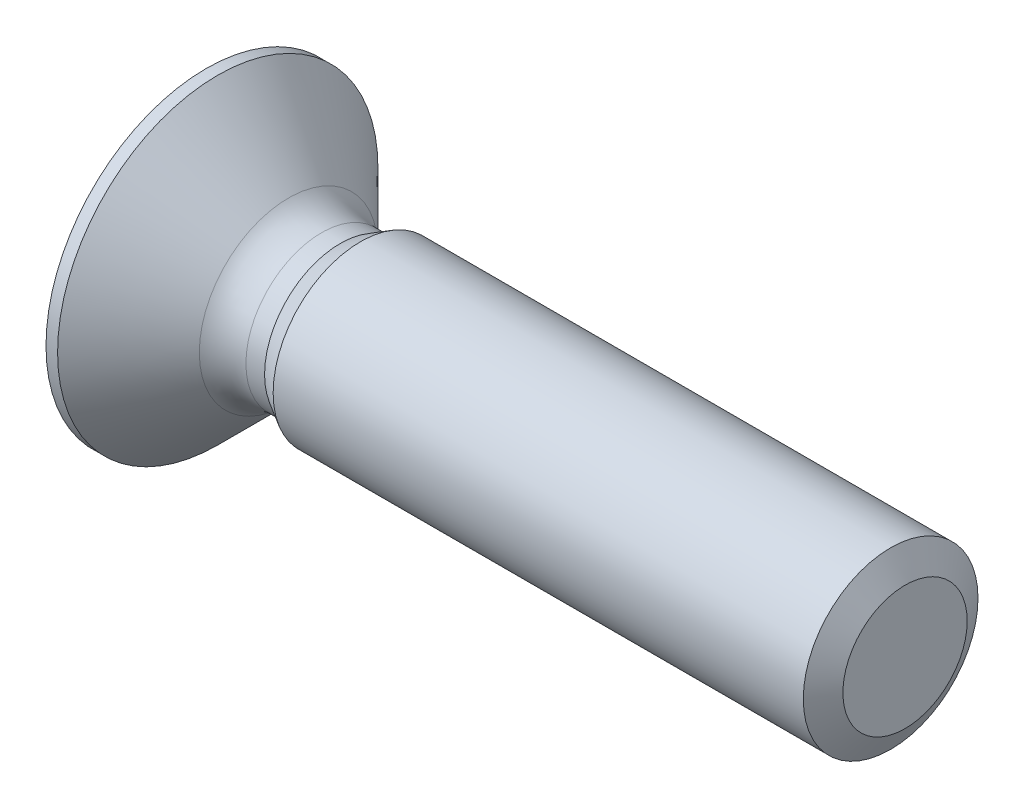
ISO-10303-21;
HEADER;
FILE_DESCRIPTION(('STEP AP214'),'2;1');
FILE_NAME('part.step','',(''),(''),'','','');
FILE_SCHEMA(('AUTOMOTIVE_DESIGN { 1 0 10303 214 1 1 1 1 }'));
ENDSEC;
DATA;
#1=APPLICATION_CONTEXT('core data for automotive mechanical design processes');
#2=APPLICATION_PROTOCOL_DEFINITION('international standard','automotive_design',2000,#1);
#3=PRODUCT_CONTEXT('',#1,'mechanical');
#4=PRODUCT('Part','Part','',(#3));
#5=PRODUCT_RELATED_PRODUCT_CATEGORY('part','',(#4));
#6=PRODUCT_DEFINITION_FORMATION('','',#4);
#7=PRODUCT_DEFINITION_CONTEXT('part definition',#1,'design');
#8=PRODUCT_DEFINITION('design','',#6,#7);
#9=PRODUCT_DEFINITION_SHAPE('','',#8);
#10=(LENGTH_UNIT() NAMED_UNIT(*) SI_UNIT(.MILLI.,.METRE.));
#11=(NAMED_UNIT(*) PLANE_ANGLE_UNIT() SI_UNIT($,.RADIAN.));
#12=(NAMED_UNIT(*) SI_UNIT($,.STERADIAN.) SOLID_ANGLE_UNIT());
#13=UNCERTAINTY_MEASURE_WITH_UNIT(LENGTH_MEASURE(1.E-05),#10,'distance_accuracy_value','');
#14=(GEOMETRIC_REPRESENTATION_CONTEXT(3) GLOBAL_UNCERTAINTY_ASSIGNED_CONTEXT((#13)) GLOBAL_UNIT_ASSIGNED_CONTEXT((#10,
#11,#12)) REPRESENTATION_CONTEXT('',''));
#15=CARTESIAN_POINT('',(0.,0.,0.));
#16=DIRECTION('',(0.,0.,1.));
#17=DIRECTION('',(1.,0.,0.));
#18=AXIS2_PLACEMENT_3D('',#15,#16,#17);
#19=CARTESIAN_POINT('',(0.,0.,0.));
#20=DIRECTION('',(1.,0.,0.));
#21=DIRECTION('',(0.,0.,-1.));
#22=AXIS2_PLACEMENT_3D('',#19,#20,#21);
#23=PLANE('',#22);
#24=CARTESIAN_POINT('',(0.,0.,0.));
#25=DIRECTION('',(-1.,0.,0.));
#26=DIRECTION('',(0.,0.,1.));
#27=AXIS2_PLACEMENT_3D('',#24,#25,#26);
#28=CIRCLE('',#27,2.75);
#29=CARTESIAN_POINT('',(0.,0.,2.75));
#30=VERTEX_POINT('',#29);
#31=EDGE_CURVE('E182',#30,#30,#28,.T.);
#32=ORIENTED_EDGE('',*,*,#31,.T.);
#33=EDGE_LOOP('',(#32));
#34=FACE_BOUND('',#33,.T.);
#35=DIRECTION('',(0.,1.,0.));
#36=VECTOR('',#35,1.);
#37=CARTESIAN_POINT('',(0.,1.6,0.250000000000006));
#38=LINE('',#37,#36);
#39=CARTESIAN_POINT('',(0.,0.25,0.250000000000001));
#40=VERTEX_POINT('',#39);
#41=CARTESIAN_POINT('',(0.,1.6,0.250000000000006));
#42=VERTEX_POINT('',#41);
#43=EDGE_CURVE('E104',#40,#42,#38,.T.);
#44=ORIENTED_EDGE('',*,*,#43,.F.);
#45=DIRECTION('',(0.,0.,-1.));
#46=VECTOR('',#45,1.);
#47=CARTESIAN_POINT('',(0.,0.25,-1.6));
#48=LINE('',#47,#46);
#49=CARTESIAN_POINT('',(0.,0.25,1.6));
#50=VERTEX_POINT('',#49);
#51=EDGE_CURVE('E149',#50,#40,#48,.T.);
#52=ORIENTED_EDGE('',*,*,#51,.F.);
#53=DIRECTION('',(0.,1.,0.));
#54=VECTOR('',#53,1.);
#55=CARTESIAN_POINT('',(0.,0.25,1.6));
#56=LINE('',#55,#54);
#57=CARTESIAN_POINT('',(0.,-0.25,1.6));
#58=VERTEX_POINT('',#57);
#59=EDGE_CURVE('E146',#58,#50,#56,.T.);
#60=ORIENTED_EDGE('',*,*,#59,.F.);
#61=DIRECTION('',(0.,0.,1.));
#62=VECTOR('',#61,1.);
#63=CARTESIAN_POINT('',(0.,-0.25,-1.6));
#64=LINE('',#63,#62);
#65=CARTESIAN_POINT('',(0.,-0.25,0.249999999999999));
#66=VERTEX_POINT('',#65);
#67=EDGE_CURVE('E77',#66,#58,#64,.T.);
#68=ORIENTED_EDGE('',*,*,#67,.F.);
#69=CARTESIAN_POINT('',(0.,-1.6,0.249999999999994));
#70=VERTEX_POINT('',#69);
#71=EDGE_CURVE('E112',#70,#66,#38,.T.);
#72=ORIENTED_EDGE('',*,*,#71,.F.);
#73=DIRECTION('',(0.,0.,1.));
#74=VECTOR('',#73,1.);
#75=CARTESIAN_POINT('',(0.,-1.6,0.249999999999994));
#76=LINE('',#75,#74);
#77=CARTESIAN_POINT('',(0.,-1.6,-0.250000000000006));
#78=VERTEX_POINT('',#77);
#79=EDGE_CURVE('E113',#78,#70,#76,.T.);
#80=ORIENTED_EDGE('',*,*,#79,.F.);
#81=DIRECTION('',(0.,-1.,0.));
#82=VECTOR('',#81,1.);
#83=CARTESIAN_POINT('',(0.,1.6,-0.249999999999994));
#84=LINE('',#83,#82);
#85=CARTESIAN_POINT('',(0.,-0.25,-0.250000000000001));
#86=VERTEX_POINT('',#85);
#87=EDGE_CURVE('E126',#86,#78,#84,.T.);
#88=ORIENTED_EDGE('',*,*,#87,.F.);
#89=CARTESIAN_POINT('',(0.,-0.25,-1.6));
#90=VERTEX_POINT('',#89);
#91=EDGE_CURVE('E143',#90,#86,#64,.T.);
#92=ORIENTED_EDGE('',*,*,#91,.F.);
#93=DIRECTION('',(0.,-1.,0.));
#94=VECTOR('',#93,1.);
#95=CARTESIAN_POINT('',(0.,0.25,-1.6));
#96=LINE('',#95,#94);
#97=CARTESIAN_POINT('',(0.,0.25,-1.6));
#98=VERTEX_POINT('',#97);
#99=EDGE_CURVE('E54',#98,#90,#96,.T.);
#100=ORIENTED_EDGE('',*,*,#99,.F.);
#101=CARTESIAN_POINT('',(0.,0.25,-0.249999999999999));
#102=VERTEX_POINT('',#101);
#103=EDGE_CURVE('E152',#102,#98,#48,.T.);
#104=ORIENTED_EDGE('',*,*,#103,.F.);
#105=CARTESIAN_POINT('',(0.,1.6,-0.249999999999994));
#106=VERTEX_POINT('',#105);
#107=EDGE_CURVE('E125',#106,#102,#84,.T.);
#108=ORIENTED_EDGE('',*,*,#107,.F.);
#109=DIRECTION('',(0.,0.,-1.));
#110=VECTOR('',#109,1.);
#111=CARTESIAN_POINT('',(0.,1.6,0.250000000000006));
#112=LINE('',#111,#110);
#113=EDGE_CURVE('E118',#42,#106,#112,.T.);
#114=ORIENTED_EDGE('',*,*,#113,.F.);
#115=EDGE_LOOP('',(#44,#52,#60,#68,#72,#80,#88,#92,#100,#104,#108,#114));
#116=FACE_BOUND('',#115,.T.);
#117=ADVANCED_FACE('F40',(#34,#116),#23,.F.);
#118=CARTESIAN_POINT('',(2.1,0.,0.));
#119=DIRECTION('',(-0.118212889785112,-0.992988274194944,0.));
#120=DIRECTION('',(0.992988274194944,-0.118212889785112,0.));
#121=AXIS2_PLACEMENT_3D('',#118,#119,#120);
#122=PLANE('',#121);
#123=ORIENTED_EDGE('',*,*,#51,.T.);
#124=DIRECTION('',(0.986122002690152,-0.117395476510732,-0.117395476510733));
#125=VECTOR('',#124,1.);
#126=CARTESIAN_POINT('',(2.1,0.,0.));
#127=LINE('',#126,#125);
#128=CARTESIAN_POINT('',(2.1,0.,0.));
#129=VERTEX_POINT('',#128);
#130=EDGE_CURVE('E83',#40,#129,#127,.T.);
#131=ORIENTED_EDGE('',*,*,#130,.T.);
#132=DIRECTION('',(0.791889207905293,-0.0942725247506301,-0.603344158404032));
#133=VECTOR('',#132,1.);
#134=CARTESIAN_POINT('',(0.,0.25,1.6));
#135=LINE('',#134,#133);
#136=EDGE_CURVE('E63',#50,#129,#135,.T.);
#137=ORIENTED_EDGE('',*,*,#136,.F.);
#138=EDGE_LOOP('',(#123,#131,#137));
#139=FACE_BOUND('',#138,.T.);
#140=ADVANCED_FACE('F198',(#139),#122,.T.);
#141=DIRECTION('',(0.791889207905293,-0.0942725247506301,0.603344158404032));
#142=VECTOR('',#141,1.);
#143=CARTESIAN_POINT('',(0.,0.25,-1.6));
#144=LINE('',#143,#142);
#145=EDGE_CURVE('E148',#98,#129,#144,.T.);
#146=ORIENTED_EDGE('',*,*,#145,.T.);
#147=DIRECTION('',(-0.986122002690152,0.117395476510732,-0.117395476510732));
#148=VECTOR('',#147,1.);
#149=CARTESIAN_POINT('',(2.1,0.,0.));
#150=LINE('',#149,#148);
#151=EDGE_CURVE('E130',#129,#102,#150,.T.);
#152=ORIENTED_EDGE('',*,*,#151,.T.);
#153=ORIENTED_EDGE('',*,*,#103,.T.);
#154=EDGE_LOOP('',(#146,#152,#153));
#155=FACE_BOUND('',#154,.T.);
#156=ADVANCED_FACE('F192',(#155),#122,.T.);
#157=CARTESIAN_POINT('',(2.1,0.,0.));
#158=DIRECTION('',(-0.118212889785112,0.992988274194944,0.));
#159=DIRECTION('',(-0.992988274194944,-0.118212889785112,0.));
#160=AXIS2_PLACEMENT_3D('',#157,#158,#159);
#161=PLANE('',#160);
#162=DIRECTION('',(0.791889207905293,0.0942725247506301,-0.603344158404032));
#163=VECTOR('',#162,1.);
#164=CARTESIAN_POINT('',(0.,-0.25,1.6));
#165=LINE('',#164,#163);
#166=EDGE_CURVE('E142',#58,#129,#165,.T.);
#167=ORIENTED_EDGE('',*,*,#166,.T.);
#168=DIRECTION('',(-0.986122002690152,-0.117395476510732,0.117395476510732));
#169=VECTOR('',#168,1.);
#170=CARTESIAN_POINT('',(2.1,0.,0.));
#171=LINE('',#170,#169);
#172=EDGE_CURVE('E11',#129,#66,#171,.T.);
#173=ORIENTED_EDGE('',*,*,#172,.T.);
#174=ORIENTED_EDGE('',*,*,#67,.T.);
#175=EDGE_LOOP('',(#167,#173,#174));
#176=FACE_BOUND('',#175,.T.);
#177=ADVANCED_FACE('F193',(#176),#161,.T.);
#178=ORIENTED_EDGE('',*,*,#91,.T.);
#179=DIRECTION('',(0.986122002690152,0.117395476510732,0.117395476510733));
#180=VECTOR('',#179,1.);
#181=CARTESIAN_POINT('',(2.1,0.,0.));
#182=LINE('',#181,#180);
#183=EDGE_CURVE('E47',#86,#129,#182,.T.);
#184=ORIENTED_EDGE('',*,*,#183,.T.);
#185=DIRECTION('',(0.791889207905293,0.0942725247506301,0.603344158404032));
#186=VECTOR('',#185,1.);
#187=CARTESIAN_POINT('',(0.,-0.25,-1.6));
#188=LINE('',#187,#186);
#189=EDGE_CURVE('E157',#90,#129,#188,.T.);
#190=ORIENTED_EDGE('',*,*,#189,.F.);
#191=EDGE_LOOP('',(#178,#184,#190));
#192=FACE_BOUND('',#191,.T.);
#193=ADVANCED_FACE('F186',(#192),#161,.T.);
#194=CARTESIAN_POINT('',(0.,0.,0.));
#195=DIRECTION('',(-1.,0.,0.));
#196=DIRECTION('',(0.,0.,1.));
#197=AXIS2_PLACEMENT_3D('',#194,#195,#196);
#198=CYLINDRICAL_SURFACE('',#197,2.75);
#199=ORIENTED_EDGE('',*,*,#31,.F.);
#200=EDGE_LOOP('',(#199));
#201=FACE_BOUND('',#200,.T.);
#202=CARTESIAN_POINT('',(0.199000000000005,0.,0.));
#203=DIRECTION('',(-1.,0.,0.));
#204=DIRECTION('',(0.,0.,1.));
#205=AXIS2_PLACEMENT_3D('',#202,#203,#204);
#206=CIRCLE('',#205,2.75);
#207=CARTESIAN_POINT('',(0.199000000000005,0.,2.75));
#208=VERTEX_POINT('',#207);
#209=EDGE_CURVE('E178',#208,#208,#206,.T.);
#210=ORIENTED_EDGE('',*,*,#209,.T.);
#211=EDGE_LOOP('',(#210));
#212=FACE_BOUND('',#211,.T.);
#213=ADVANCED_FACE('F226',(#201,#212),#198,.T.);
#214=CARTESIAN_POINT('',(1.41568542494924,0.,0.));
#215=DIRECTION('',(-1.,0.,0.));
#216=DIRECTION('',(0.,0.,1.));
#217=AXIS2_PLACEMENT_3D('',#214,#215,#216);
#218=CONICAL_SURFACE('',#217,1.53331457505076,0.78539816339745);
#219=ORIENTED_EDGE('',*,*,#209,.F.);
#220=EDGE_LOOP('',(#219));
#221=FACE_BOUND('',#220,.T.);
#222=CARTESIAN_POINT('',(1.41568542494924,0.,0.));
#223=DIRECTION('',(-1.,0.,0.));
#224=DIRECTION('',(0.,0.,1.));
#225=AXIS2_PLACEMENT_3D('',#222,#223,#224);
#226=CIRCLE('',#225,1.53331457505076);
#227=CARTESIAN_POINT('',(1.41568542494924,0.,1.53331457505076));
#228=VERTEX_POINT('',#227);
#229=EDGE_CURVE('E174',#228,#228,#226,.T.);
#230=ORIENTED_EDGE('',*,*,#229,.T.);
#231=EDGE_LOOP('',(#230));
#232=FACE_BOUND('',#231,.T.);
#233=ADVANCED_FACE('F229',(#221,#232),#218,.T.);
#234=CARTESIAN_POINT('',(1.98137084989848,0.,0.));
#235=DIRECTION('',(-1.,0.,0.));
#236=DIRECTION('',(0.,0.,1.));
#237=AXIS2_PLACEMENT_3D('',#234,#235,#236);
#238=TOROIDAL_SURFACE('',#237,2.099,0.8);
#239=ORIENTED_EDGE('',*,*,#229,.F.);
#240=EDGE_LOOP('',(#239));
#241=FACE_BOUND('',#240,.T.);
#242=CARTESIAN_POINT('',(1.98137084989848,0.,0.));
#243=DIRECTION('',(-1.,0.,0.));
#244=DIRECTION('',(0.,0.,1.));
#245=AXIS2_PLACEMENT_3D('',#242,#243,#244);
#246=CIRCLE('',#245,1.299);
#247=CARTESIAN_POINT('',(1.98137084989848,0.,1.299));
#248=VERTEX_POINT('',#247);
#249=EDGE_CURVE('E171',#248,#248,#246,.T.);
#250=ORIENTED_EDGE('',*,*,#249,.T.);
#251=EDGE_LOOP('',(#250));
#252=FACE_BOUND('',#251,.T.);
#253=ADVANCED_FACE('F234',(#241,#252),#238,.F.);
#254=CARTESIAN_POINT('',(0.,0.,0.));
#255=DIRECTION('',(-1.,0.,0.));
#256=DIRECTION('',(0.,0.,1.));
#257=AXIS2_PLACEMENT_3D('',#254,#255,#256);
#258=CYLINDRICAL_SURFACE('',#257,1.299);
#259=ORIENTED_EDGE('',*,*,#249,.F.);
#260=EDGE_LOOP('',(#259));
#261=FACE_BOUND('',#260,.T.);
#262=CARTESIAN_POINT('',(2.30185778767866,0.,0.));
#263=DIRECTION('',(-1.,0.,0.));
#264=DIRECTION('',(0.,0.,1.));
#265=AXIS2_PLACEMENT_3D('',#262,#263,#264);
#266=CIRCLE('',#265,1.299);
#267=CARTESIAN_POINT('',(2.30185778767866,0.,1.299));
#268=VERTEX_POINT('',#267);
#269=EDGE_CURVE('E168',#268,#268,#266,.T.);
#270=ORIENTED_EDGE('',*,*,#269,.T.);
#271=EDGE_LOOP('',(#270));
#272=FACE_BOUND('',#271,.T.);
#273=ADVANCED_FACE('F240',(#261,#272),#258,.T.);
#274=CARTESIAN_POINT('',(2.65,0.,0.));
#275=DIRECTION('',(1.,0.,0.));
#276=DIRECTION('',(0.,0.,-1.));
#277=AXIS2_PLACEMENT_3D('',#274,#275,#276);
#278=CONICAL_SURFACE('',#277,1.5,0.5235987755983);
#279=ORIENTED_EDGE('',*,*,#269,.F.);
#280=EDGE_LOOP('',(#279));
#281=FACE_BOUND('',#280,.T.);
#282=CARTESIAN_POINT('',(2.65,0.,0.));
#283=DIRECTION('',(-1.,0.,0.));
#284=DIRECTION('',(0.,0.,1.));
#285=AXIS2_PLACEMENT_3D('',#282,#283,#284);
#286=CIRCLE('',#285,1.5);
#287=CARTESIAN_POINT('',(2.65,0.,1.5));
#288=VERTEX_POINT('',#287);
#289=EDGE_CURVE('E165',#288,#288,#286,.T.);
#290=ORIENTED_EDGE('',*,*,#289,.T.);
#291=EDGE_LOOP('',(#290));
#292=FACE_BOUND('',#291,.T.);
#293=ADVANCED_FACE('F246',(#281,#292),#278,.T.);
#294=CARTESIAN_POINT('',(0.,0.,0.));
#295=DIRECTION('',(-1.,0.,0.));
#296=DIRECTION('',(0.,0.,1.));
#297=AXIS2_PLACEMENT_3D('',#294,#295,#296);
#298=CYLINDRICAL_SURFACE('',#297,1.5);
#299=CARTESIAN_POINT('',(11.7527080028712,0.,0.));
#300=DIRECTION('',(1.,0.,0.));
#301=DIRECTION('',(0.,0.,-1.));
#302=AXIS2_PLACEMENT_3D('',#299,#300,#301);
#303=CIRCLE('',#302,1.5);
#304=CARTESIAN_POINT('',(11.7527080028712,0.,-1.5));
#305=VERTEX_POINT('',#304);
#306=EDGE_CURVE('E162',#305,#305,#303,.T.);
#307=ORIENTED_EDGE('',*,*,#306,.F.);
#308=EDGE_LOOP('',(#307));
#309=FACE_BOUND('',#308,.T.);
#310=ORIENTED_EDGE('',*,*,#289,.F.);
#311=EDGE_LOOP('',(#310));
#312=FACE_BOUND('',#311,.T.);
#313=ADVANCED_FACE('F252',(#309,#312),#298,.T.);
#314=CARTESIAN_POINT('',(11.7527080028712,0.,0.));
#315=DIRECTION('',(-1.,0.,0.));
#316=DIRECTION('',(0.,0.,1.));
#317=AXIS2_PLACEMENT_3D('',#314,#315,#316);
#318=CONICAL_SURFACE('',#317,1.5,1.05188801855135);
#319=CARTESIAN_POINT('',(12.,0.,0.));
#320=DIRECTION('',(1.,0.,0.));
#321=DIRECTION('',(0.,0.,-1.));
#322=AXIS2_PLACEMENT_3D('',#319,#320,#321);
#323=CIRCLE('',#322,1.067);
#324=CARTESIAN_POINT('',(12.,0.,-1.067));
#325=VERTEX_POINT('',#324);
#326=EDGE_CURVE('E151',#325,#325,#323,.T.);
#327=ORIENTED_EDGE('',*,*,#326,.F.);
#328=EDGE_LOOP('',(#327));
#329=FACE_BOUND('',#328,.T.);
#330=ORIENTED_EDGE('',*,*,#306,.T.);
#331=EDGE_LOOP('',(#330));
#332=FACE_BOUND('',#331,.T.);
#333=ADVANCED_FACE('F257',(#329,#332),#318,.T.);
#334=CARTESIAN_POINT('',(12.,1.5,0.));
#335=DIRECTION('',(-1.,0.,0.));
#336=DIRECTION('',(0.,0.,1.));
#337=AXIS2_PLACEMENT_3D('',#334,#335,#336);
#338=PLANE('',#337);
#339=ORIENTED_EDGE('',*,*,#326,.T.);
#340=EDGE_LOOP('',(#339));
#341=FACE_BOUND('',#340,.T.);
#342=ADVANCED_FACE('F263',(#341),#338,.F.);
#343=CARTESIAN_POINT('',(0.,0.25,-1.6));
#344=DIRECTION('',(0.606043215262856,0.,-0.795431720032499));
#345=DIRECTION('',(-0.795431720032499,0.,-0.606043215262856));
#346=AXIS2_PLACEMENT_3D('',#343,#344,#345);
#347=PLANE('',#346);
#348=ORIENTED_EDGE('',*,*,#145,.F.);
#349=ORIENTED_EDGE('',*,*,#99,.T.);
#350=ORIENTED_EDGE('',*,*,#189,.T.);
#351=EDGE_LOOP('',(#348,#349,#350));
#352=FACE_BOUND('',#351,.T.);
#353=ADVANCED_FACE('F190',(#352),#347,.F.);
#354=CARTESIAN_POINT('',(0.,-0.25,1.6));
#355=DIRECTION('',(0.606043215262856,0.,0.795431720032499));
#356=DIRECTION('',(0.795431720032499,0.,-0.606043215262856));
#357=AXIS2_PLACEMENT_3D('',#354,#355,#356);
#358=PLANE('',#357);
#359=ORIENTED_EDGE('',*,*,#166,.F.);
#360=ORIENTED_EDGE('',*,*,#59,.T.);
#361=ORIENTED_EDGE('',*,*,#136,.T.);
#362=EDGE_LOOP('',(#359,#360,#361));
#363=FACE_BOUND('',#362,.T.);
#364=ADVANCED_FACE('F197',(#363),#358,.F.);
#365=CARTESIAN_POINT('',(2.1,0.,0.));
#366=DIRECTION('',(-0.118212889785112,0.,-0.992988274194944));
#367=DIRECTION('',(0.992988274194944,0.,-0.118212889785112));
#368=AXIS2_PLACEMENT_3D('',#365,#366,#367);
#369=PLANE('',#368);
#370=DIRECTION('',(0.791889207905293,0.603344158404033,-0.0942725247506279));
#371=VECTOR('',#370,1.);
#372=CARTESIAN_POINT('',(0.,-1.6,0.249999999999994));
#373=LINE('',#372,#371);
#374=EDGE_CURVE('E122',#70,#129,#373,.T.);
#375=ORIENTED_EDGE('',*,*,#374,.F.);
#376=ORIENTED_EDGE('',*,*,#71,.T.);
#377=ORIENTED_EDGE('',*,*,#172,.F.);
#378=EDGE_LOOP('',(#375,#376,#377));
#379=FACE_BOUND('',#378,.T.);
#380=ADVANCED_FACE('F202',(#379),#369,.T.);
#381=CARTESIAN_POINT('',(2.1,0.,0.));
#382=DIRECTION('',(-0.118212889785112,0.,0.992988274194944));
#383=DIRECTION('',(-0.992988274194944,0.,-0.118212889785112));
#384=AXIS2_PLACEMENT_3D('',#381,#382,#383);
#385=PLANE('',#384);
#386=ORIENTED_EDGE('',*,*,#87,.T.);
#387=DIRECTION('',(0.791889207905293,0.603344158404032,0.0942725247506322));
#388=VECTOR('',#387,1.);
#389=CARTESIAN_POINT('',(0.,-1.6,-0.250000000000006));
#390=LINE('',#389,#388);
#391=EDGE_CURVE('E136',#78,#129,#390,.T.);
#392=ORIENTED_EDGE('',*,*,#391,.T.);
#393=ORIENTED_EDGE('',*,*,#183,.F.);
#394=EDGE_LOOP('',(#386,#392,#393));
#395=FACE_BOUND('',#394,.T.);
#396=ADVANCED_FACE('F206',(#395),#385,.T.);
#397=CARTESIAN_POINT('',(0.,-1.6,-0.250000000000006));
#398=DIRECTION('',(0.606043215262856,-0.795431720032499,0.));
#399=DIRECTION('',(0.795431720032499,0.606043215262856,0.));
#400=AXIS2_PLACEMENT_3D('',#397,#398,#399);
#401=PLANE('',#400);
#402=ORIENTED_EDGE('',*,*,#391,.F.);
#403=ORIENTED_EDGE('',*,*,#79,.T.);
#404=ORIENTED_EDGE('',*,*,#374,.T.);
#405=EDGE_LOOP('',(#402,#403,#404));
#406=FACE_BOUND('',#405,.T.);
#407=ADVANCED_FACE('F205',(#406),#401,.F.);
#408=ORIENTED_EDGE('',*,*,#43,.T.);
#409=DIRECTION('',(0.791889207905293,-0.603344158404032,-0.0942725247506322));
#410=VECTOR('',#409,1.);
#411=CARTESIAN_POINT('',(0.,1.6,0.250000000000006));
#412=LINE('',#411,#410);
#413=EDGE_CURVE('E107',#42,#129,#412,.T.);
#414=ORIENTED_EDGE('',*,*,#413,.T.);
#415=ORIENTED_EDGE('',*,*,#130,.F.);
#416=EDGE_LOOP('',(#408,#414,#415));
#417=FACE_BOUND('',#416,.T.);
#418=ADVANCED_FACE('F106',(#417),#369,.T.);
#419=DIRECTION('',(0.791889207905293,-0.603344158404033,0.0942725247506279));
#420=VECTOR('',#419,1.);
#421=CARTESIAN_POINT('',(0.,1.6,-0.249999999999994));
#422=LINE('',#421,#420);
#423=EDGE_CURVE('E120',#106,#129,#422,.T.);
#424=ORIENTED_EDGE('',*,*,#423,.F.);
#425=ORIENTED_EDGE('',*,*,#107,.T.);
#426=ORIENTED_EDGE('',*,*,#151,.F.);
#427=EDGE_LOOP('',(#424,#425,#426));
#428=FACE_BOUND('',#427,.T.);
#429=ADVANCED_FACE('F209',(#428),#385,.T.);
#430=CARTESIAN_POINT('',(0.,1.6,0.250000000000006));
#431=DIRECTION('',(0.606043215262856,0.795431720032499,0.));
#432=DIRECTION('',(-0.795431720032499,0.606043215262856,0.));
#433=AXIS2_PLACEMENT_3D('',#430,#431,#432);
#434=PLANE('',#433);
#435=ORIENTED_EDGE('',*,*,#413,.F.);
#436=ORIENTED_EDGE('',*,*,#113,.T.);
#437=ORIENTED_EDGE('',*,*,#423,.T.);
#438=EDGE_LOOP('',(#435,#436,#437));
#439=FACE_BOUND('',#438,.T.);
#440=ADVANCED_FACE('F117',(#439),#434,.F.);
#441=CLOSED_SHELL('',(#117,#140,#156,#177,#193,#213,#233,#253,#273,#293,#313,#333,#342,#353,
#364,#380,#396,#407,#418,#429,#440));
#442=MANIFOLD_SOLID_BREP('B2',#441);
#443=ADVANCED_BREP_SHAPE_REPRESENTATION('',(#18,#442),#14);
#444=SHAPE_DEFINITION_REPRESENTATION(#9,#443);
ENDSEC;
END-ISO-10303-21;
